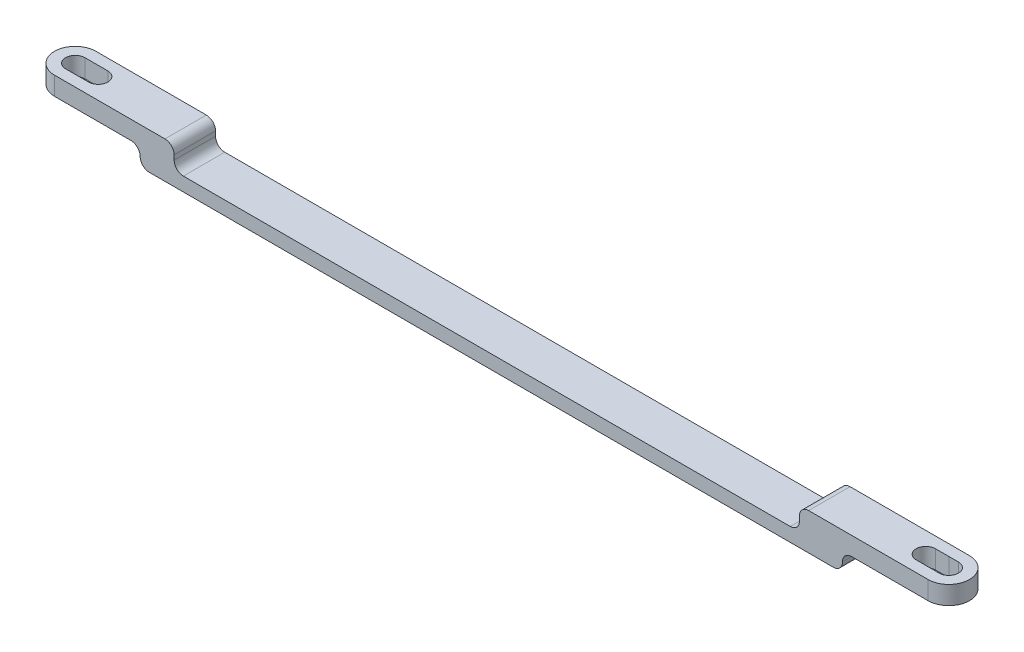
ISO-10303-21;
HEADER;
FILE_DESCRIPTION(('STEP AP214'),'2;1');
FILE_NAME('part.step','',(''),(''),'','','');
FILE_SCHEMA(('AUTOMOTIVE_DESIGN { 1 0 10303 214 1 1 1 1 }'));
ENDSEC;
DATA;
#1=APPLICATION_CONTEXT('core data for automotive mechanical design processes');
#2=APPLICATION_PROTOCOL_DEFINITION('international standard','automotive_design',2000,#1);
#3=PRODUCT_CONTEXT('',#1,'mechanical');
#4=PRODUCT('Part','Part','',(#3));
#5=PRODUCT_RELATED_PRODUCT_CATEGORY('part','',(#4));
#6=PRODUCT_DEFINITION_FORMATION('','',#4);
#7=PRODUCT_DEFINITION_CONTEXT('part definition',#1,'design');
#8=PRODUCT_DEFINITION('design','',#6,#7);
#9=PRODUCT_DEFINITION_SHAPE('','',#8);
#10=(LENGTH_UNIT() NAMED_UNIT(*) SI_UNIT(.MILLI.,.METRE.));
#11=(NAMED_UNIT(*) PLANE_ANGLE_UNIT() SI_UNIT($,.RADIAN.));
#12=(NAMED_UNIT(*) SI_UNIT($,.STERADIAN.) SOLID_ANGLE_UNIT());
#13=UNCERTAINTY_MEASURE_WITH_UNIT(LENGTH_MEASURE(1.E-05),#10,'distance_accuracy_value','');
#14=(GEOMETRIC_REPRESENTATION_CONTEXT(3) GLOBAL_UNCERTAINTY_ASSIGNED_CONTEXT((#13)) GLOBAL_UNIT_ASSIGNED_CONTEXT((#10,
#11,#12)) REPRESENTATION_CONTEXT('',''));
#15=CARTESIAN_POINT('',(0.,0.,0.));
#16=DIRECTION('',(0.,0.,1.));
#17=DIRECTION('',(1.,0.,0.));
#18=AXIS2_PLACEMENT_3D('',#15,#16,#17);
#19=CARTESIAN_POINT('',(0.,4.,0.));
#20=DIRECTION('',(0.,1.,0.));
#21=DIRECTION('',(0.,0.,1.));
#22=AXIS2_PLACEMENT_3D('',#19,#20,#21);
#23=PLANE('',#22);
#24=DIRECTION('',(-1.,0.,0.));
#25=VECTOR('',#24,1.);
#26=CARTESIAN_POINT('',(0.,4.,-4.49999946573208));
#27=LINE('',#26,#25);
#28=CARTESIAN_POINT('',(184.999999457065,4.,-4.49999946573208));
#29=VERTEX_POINT('',#28);
#30=CARTESIAN_POINT('',(159.020897583526,4.,-4.49999946573206));
#31=VERTEX_POINT('',#30);
#32=EDGE_CURVE('E276',#29,#31,#27,.T.);
#33=ORIENTED_EDGE('',*,*,#32,.T.);
#34=DIRECTION('',(0.,0.,-1.));
#35=VECTOR('',#34,1.);
#36=CARTESIAN_POINT('',(159.020897583526,4.,4.50000000000002));
#37=LINE('',#36,#35);
#38=CARTESIAN_POINT('',(159.020897583526,4.,4.49999946573208));
#39=VERTEX_POINT('',#38);
#40=EDGE_CURVE('E49',#31,#39,#37,.F.);
#41=ORIENTED_EDGE('',*,*,#40,.T.);
#42=DIRECTION('',(-1.,0.,0.));
#43=VECTOR('',#42,1.);
#44=CARTESIAN_POINT('',(0.,4.,4.49999946573208));
#45=LINE('',#44,#43);
#46=CARTESIAN_POINT('',(184.999999457065,4.,4.49999946573205));
#47=VERTEX_POINT('',#46);
#48=EDGE_CURVE('E282',#47,#39,#45,.T.);
#49=ORIENTED_EDGE('',*,*,#48,.F.);
#50=CARTESIAN_POINT('',(184.999999457065,4.,0.));
#51=DIRECTION('',(0.,1.,0.));
#52=DIRECTION('',(0.,0.,1.));
#53=AXIS2_PLACEMENT_3D('',#50,#51,#52);
#54=CIRCLE('',#53,4.49999946573207);
#55=EDGE_CURVE('E284',#47,#29,#54,.T.);
#56=ORIENTED_EDGE('',*,*,#55,.T.);
#57=EDGE_LOOP('',(#33,#41,#49,#56));
#58=FACE_BOUND('',#57,.T.);
#59=CARTESIAN_POINT('',(178.950000000015,4.,2.77148096139435E-11));
#60=DIRECTION('',(0.,1.,0.));
#61=DIRECTION('',(0.,0.,1.));
#62=AXIS2_PLACEMENT_3D('',#59,#60,#61);
#63=CIRCLE('',#62,4.49999946573207);
#64=CARTESIAN_POINT('',(182.930860124195,4.,-2.0982725902941));
#65=VERTEX_POINT('',#64);
#66=CARTESIAN_POINT('',(182.925849231003,4.,-2.1077519028382));
#67=VERTEX_POINT('',#66);
#68=EDGE_CURVE('E257',#65,#67,#63,.T.);
#69=ORIENTED_EDGE('',*,*,#68,.F.);
#70=DIRECTION('',(1.,0.,0.));
#71=VECTOR('',#70,1.);
#72=CARTESIAN_POINT('',(0.,4.,-2.09827259029412));
#73=LINE('',#72,#71);
#74=CARTESIAN_POINT('',(184.999999457065,4.,-2.0982725902941));
#75=VERTEX_POINT('',#74);
#76=EDGE_CURVE('E260',#65,#75,#73,.T.);
#77=ORIENTED_EDGE('',*,*,#76,.T.);
#78=CARTESIAN_POINT('',(184.999999457065,4.,0.));
#79=DIRECTION('',(0.,1.,0.));
#80=DIRECTION('',(0.,0.,1.));
#81=AXIS2_PLACEMENT_3D('',#78,#79,#80);
#82=CIRCLE('',#81,2.0982725902941);
#83=CARTESIAN_POINT('',(184.999999457065,4.,2.0982725902941));
#84=VERTEX_POINT('',#83);
#85=EDGE_CURVE('E262',#84,#75,#82,.T.);
#86=ORIENTED_EDGE('',*,*,#85,.F.);
#87=DIRECTION('',(1.,0.,0.));
#88=VECTOR('',#87,1.);
#89=CARTESIAN_POINT('',(0.,4.,2.0982725902941));
#90=LINE('',#89,#88);
#91=CARTESIAN_POINT('',(179.999998560699,4.,2.0982725902941));
#92=VERTEX_POINT('',#91);
#93=EDGE_CURVE('E266',#92,#84,#90,.T.);
#94=ORIENTED_EDGE('',*,*,#93,.F.);
#95=CARTESIAN_POINT('',(179.999998560699,4.,0.));
#96=DIRECTION('',(0.,1.,0.));
#97=DIRECTION('',(0.,0.,1.));
#98=AXIS2_PLACEMENT_3D('',#95,#96,#97);
#99=CIRCLE('',#98,2.0982725902941);
#100=CARTESIAN_POINT('',(179.999998560699,4.,-2.0982725902941));
#101=VERTEX_POINT('',#100);
#102=EDGE_CURVE('E269',#101,#92,#99,.T.);
#103=ORIENTED_EDGE('',*,*,#102,.F.);
#104=CARTESIAN_POINT('',(182.917630381031,4.,-2.09827259029409));
#105=VERTEX_POINT('',#104);
#106=EDGE_CURVE('E263',#101,#105,#73,.T.);
#107=ORIENTED_EDGE('',*,*,#106,.T.);
#108=DIRECTION('',(-0.655087365602055,0.,0.755553137395749));
#109=VECTOR('',#108,1.);
#110=CARTESIAN_POINT('',(103.381910909006,4.,89.6352358508098));
#111=LINE('',#110,#109);
#112=EDGE_CURVE('E272',#67,#105,#111,.T.);
#113=ORIENTED_EDGE('',*,*,#112,.F.);
#114=EDGE_LOOP('',(#69,#77,#86,#94,#103,#107,#113));
#115=FACE_BOUND('',#114,.T.);
#116=ADVANCED_FACE('F32',(#58,#115),#23,.T.);
#117=CARTESIAN_POINT('',(0.,0.,0.));
#118=DIRECTION('',(0.,1.,0.));
#119=DIRECTION('',(0.,0.,1.));
#120=AXIS2_PLACEMENT_3D('',#117,#118,#119);
#121=PLANE('',#120);
#122=CARTESIAN_POINT('',(178.950000000015,0.,2.77148096139435E-11));
#123=DIRECTION('',(0.,1.,0.));
#124=DIRECTION('',(0.,0.,1.));
#125=AXIS2_PLACEMENT_3D('',#122,#123,#124);
#126=CIRCLE('',#125,4.49999946573207);
#127=CARTESIAN_POINT('',(182.930860124195,0.,-2.0982725902941));
#128=VERTEX_POINT('',#127);
#129=CARTESIAN_POINT('',(182.925849231003,0.,-2.1077519028382));
#130=VERTEX_POINT('',#129);
#131=EDGE_CURVE('E297',#128,#130,#126,.T.);
#132=ORIENTED_EDGE('',*,*,#131,.T.);
#133=DIRECTION('',(-0.655087365602055,0.,0.755553137395749));
#134=VECTOR('',#133,1.);
#135=CARTESIAN_POINT('',(103.381910909006,0.,89.6352358508098));
#136=LINE('',#135,#134);
#137=CARTESIAN_POINT('',(182.917630381031,0.,-2.09827259029409));
#138=VERTEX_POINT('',#137);
#139=EDGE_CURVE('E313',#130,#138,#136,.T.);
#140=ORIENTED_EDGE('',*,*,#139,.T.);
#141=DIRECTION('',(1.,0.,0.));
#142=VECTOR('',#141,1.);
#143=CARTESIAN_POINT('',(0.,0.,-2.09827259029412));
#144=LINE('',#143,#142);
#145=CARTESIAN_POINT('',(179.999998560699,0.,-2.0982725902941));
#146=VERTEX_POINT('',#145);
#147=EDGE_CURVE('E304',#146,#138,#144,.T.);
#148=ORIENTED_EDGE('',*,*,#147,.F.);
#149=CARTESIAN_POINT('',(179.999998560699,0.,0.));
#150=DIRECTION('',(0.,1.,0.));
#151=DIRECTION('',(0.,0.,1.));
#152=AXIS2_PLACEMENT_3D('',#149,#150,#151);
#153=CIRCLE('',#152,2.0982725902941);
#154=CARTESIAN_POINT('',(179.999998560699,0.,2.0982725902941));
#155=VERTEX_POINT('',#154);
#156=EDGE_CURVE('E310',#146,#155,#153,.T.);
#157=ORIENTED_EDGE('',*,*,#156,.T.);
#158=DIRECTION('',(1.,0.,0.));
#159=VECTOR('',#158,1.);
#160=CARTESIAN_POINT('',(0.,0.,2.0982725902941));
#161=LINE('',#160,#159);
#162=CARTESIAN_POINT('',(184.999999457065,0.,2.0982725902941));
#163=VERTEX_POINT('',#162);
#164=EDGE_CURVE('E307',#155,#163,#161,.T.);
#165=ORIENTED_EDGE('',*,*,#164,.T.);
#166=CARTESIAN_POINT('',(184.999999457065,0.,0.));
#167=DIRECTION('',(0.,1.,0.));
#168=DIRECTION('',(0.,0.,1.));
#169=AXIS2_PLACEMENT_3D('',#166,#167,#168);
#170=CIRCLE('',#169,2.0982725902941);
#171=CARTESIAN_POINT('',(184.999999457065,0.,-2.0982725902941));
#172=VERTEX_POINT('',#171);
#173=EDGE_CURVE('E303',#163,#172,#170,.T.);
#174=ORIENTED_EDGE('',*,*,#173,.T.);
#175=EDGE_CURVE('E300',#128,#172,#144,.T.);
#176=ORIENTED_EDGE('',*,*,#175,.F.);
#177=EDGE_LOOP('',(#132,#140,#148,#157,#165,#174,#176));
#178=FACE_BOUND('',#177,.T.);
#179=DIRECTION('',(-1.,0.,0.));
#180=VECTOR('',#179,1.);
#181=CARTESIAN_POINT('',(0.,0.,4.49999946573208));
#182=LINE('',#181,#180);
#183=CARTESIAN_POINT('',(184.999999457065,0.,4.49999946573205));
#184=VERTEX_POINT('',#183);
#185=CARTESIAN_POINT('',(168.374342947361,0.,4.49999946573208));
#186=VERTEX_POINT('',#185);
#187=EDGE_CURVE('E324',#184,#186,#182,.T.);
#188=ORIENTED_EDGE('',*,*,#187,.T.);
#189=DIRECTION('',(0.,0.,1.));
#190=VECTOR('',#189,1.);
#191=CARTESIAN_POINT('',(168.374342947361,0.,-4.49999946573206));
#192=LINE('',#191,#190);
#193=CARTESIAN_POINT('',(168.374342947361,0.,-4.49999946573206));
#194=VERTEX_POINT('',#193);
#195=EDGE_CURVE('E397',#186,#194,#192,.F.);
#196=ORIENTED_EDGE('',*,*,#195,.T.);
#197=DIRECTION('',(-1.,0.,0.));
#198=VECTOR('',#197,1.);
#199=CARTESIAN_POINT('',(0.,0.,-4.49999946573208));
#200=LINE('',#199,#198);
#201=CARTESIAN_POINT('',(184.999999457065,0.,-4.49999946573208));
#202=VERTEX_POINT('',#201);
#203=EDGE_CURVE('E317',#202,#194,#200,.T.);
#204=ORIENTED_EDGE('',*,*,#203,.F.);
#205=CARTESIAN_POINT('',(184.999999457065,0.,0.));
#206=DIRECTION('',(0.,1.,0.));
#207=DIRECTION('',(0.,0.,1.));
#208=AXIS2_PLACEMENT_3D('',#205,#206,#207);
#209=CIRCLE('',#208,4.49999946573207);
#210=EDGE_CURVE('E248',#184,#202,#209,.T.);
#211=ORIENTED_EDGE('',*,*,#210,.F.);
#212=EDGE_LOOP('',(#188,#196,#204,#211));
#213=FACE_BOUND('',#212,.T.);
#214=ADVANCED_FACE('F433',(#178,#213),#121,.F.);
#215=CARTESIAN_POINT('',(0.,0.,0.));
#216=DIRECTION('',(0.,1.,0.));
#217=DIRECTION('',(0.,0.,1.));
#218=AXIS2_PLACEMENT_3D('',#215,#216,#217);
#219=CIRCLE('',#218,2.09999937075112);
#220=CARTESIAN_POINT('',(0.,0.,2.09999937075112));
#221=VERTEX_POINT('',#220);
#222=CARTESIAN_POINT('',(0.,0.,-2.09999937075112));
#223=VERTEX_POINT('',#222);
#224=EDGE_CURVE('E231',#221,#223,#219,.T.);
#225=ORIENTED_EDGE('',*,*,#224,.T.);
#226=DIRECTION('',(1.,0.,0.));
#227=VECTOR('',#226,1.);
#228=CARTESIAN_POINT('',(0.,0.,-2.09999937075112));
#229=LINE('',#228,#227);
#230=CARTESIAN_POINT('',(-5.,0.,-2.09999937075112));
#231=VERTEX_POINT('',#230);
#232=EDGE_CURVE('E294',#231,#223,#229,.T.);
#233=ORIENTED_EDGE('',*,*,#232,.F.);
#234=CARTESIAN_POINT('',(-5.,0.,0.));
#235=DIRECTION('',(0.,1.,0.));
#236=DIRECTION('',(0.,0.,1.));
#237=AXIS2_PLACEMENT_3D('',#234,#235,#236);
#238=CIRCLE('',#237,2.09999937075112);
#239=CARTESIAN_POINT('',(-5.,0.,2.09999937075112));
#240=VERTEX_POINT('',#239);
#241=EDGE_CURVE('E291',#231,#240,#238,.T.);
#242=ORIENTED_EDGE('',*,*,#241,.T.);
#243=DIRECTION('',(1.,0.,0.));
#244=VECTOR('',#243,1.);
#245=CARTESIAN_POINT('',(0.,0.,2.09999937075112));
#246=LINE('',#245,#244);
#247=EDGE_CURVE('E288',#240,#221,#246,.T.);
#248=ORIENTED_EDGE('',*,*,#247,.T.);
#249=EDGE_LOOP('',(#225,#233,#242,#248));
#250=FACE_BOUND('',#249,.T.);
#251=CARTESIAN_POINT('',(11.6256570526385,0.,-4.49999946573208));
#252=VERTEX_POINT('',#251);
#253=CARTESIAN_POINT('',(-5.,0.,-4.49999946573208));
#254=VERTEX_POINT('',#253);
#255=EDGE_CURVE('E316',#252,#254,#200,.T.);
#256=ORIENTED_EDGE('',*,*,#255,.F.);
#257=DIRECTION('',(0.,0.,-1.));
#258=VECTOR('',#257,1.);
#259=CARTESIAN_POINT('',(11.6256570526385,0.,4.49999946573208));
#260=LINE('',#259,#258);
#261=CARTESIAN_POINT('',(11.6256570526385,0.,4.49999946573208));
#262=VERTEX_POINT('',#261);
#263=EDGE_CURVE('E395',#252,#262,#260,.F.);
#264=ORIENTED_EDGE('',*,*,#263,.T.);
#265=CARTESIAN_POINT('',(-5.,0.,4.49999946573208));
#266=VERTEX_POINT('',#265);
#267=EDGE_CURVE('E323',#262,#266,#182,.T.);
#268=ORIENTED_EDGE('',*,*,#267,.T.);
#269=CARTESIAN_POINT('',(-5.,0.,0.));
#270=DIRECTION('',(0.,1.,0.));
#271=DIRECTION('',(0.,0.,1.));
#272=AXIS2_PLACEMENT_3D('',#269,#270,#271);
#273=CIRCLE('',#272,4.49999946573208);
#274=EDGE_CURVE('E320',#254,#266,#273,.T.);
#275=ORIENTED_EDGE('',*,*,#274,.F.);
#276=EDGE_LOOP('',(#256,#264,#268,#275));
#277=FACE_BOUND('',#276,.T.);
#278=ADVANCED_FACE('F481',(#250,#277),#121,.F.);
#279=CARTESIAN_POINT('',(0.,4.,-4.49999946573208));
#280=DIRECTION('',(0.,0.,1.));
#281=DIRECTION('',(1.,0.,0.));
#282=AXIS2_PLACEMENT_3D('',#279,#280,#281);
#283=PLANE('',#282);
#284=DIRECTION('',(1.,0.,0.));
#285=VECTOR('',#284,1.);
#286=CARTESIAN_POINT('',(13.6256570526385,-4.,-4.50000053426794));
#287=LINE('',#286,#285);
#288=CARTESIAN_POINT('',(15.6256570526385,-4.,-4.50000053426794));
#289=VERTEX_POINT('',#288);
#290=CARTESIAN_POINT('',(164.374342947361,-4.,-4.50000053426794));
#291=VERTEX_POINT('',#290);
#292=EDGE_CURVE('E289',#289,#291,#287,.T.);
#293=ORIENTED_EDGE('',*,*,#292,.F.);
#294=CARTESIAN_POINT('',(15.6256570526385,-2.,-4.49999946573208));
#295=DIRECTION('',(0.,0.,1.));
#296=DIRECTION('',(1.,0.,0.));
#297=AXIS2_PLACEMENT_3D('',#294,#295,#296);
#298=CIRCLE('',#297,2.);
#299=CARTESIAN_POINT('',(13.6256570526385,-2.,-4.50000053426794));
#300=VERTEX_POINT('',#299);
#301=EDGE_CURVE('E378',#289,#300,#298,.F.);
#302=ORIENTED_EDGE('',*,*,#301,.T.);
#303=CARTESIAN_POINT('',(11.6256570526385,-2.,-4.49999946573208));
#304=DIRECTION('',(0.,0.,1.));
#305=DIRECTION('',(1.,0.,0.));
#306=AXIS2_PLACEMENT_3D('',#303,#304,#305);
#307=CIRCLE('',#306,2.);
#308=EDGE_CURVE('E408',#300,#252,#307,.T.);
#309=ORIENTED_EDGE('',*,*,#308,.T.);
#310=ORIENTED_EDGE('',*,*,#255,.T.);
#311=DIRECTION('',(0.,-1.,0.));
#312=VECTOR('',#311,1.);
#313=CARTESIAN_POINT('',(-5.,4.,-4.49999946573208));
#314=LINE('',#313,#312);
#315=CARTESIAN_POINT('',(-5.,4.,-4.49999946573208));
#316=VERTEX_POINT('',#315);
#317=EDGE_CURVE('E336',#316,#254,#314,.T.);
#318=ORIENTED_EDGE('',*,*,#317,.F.);
#319=CARTESIAN_POINT('',(19.0208975835264,4.,-4.49999946573208));
#320=VERTEX_POINT('',#319);
#321=EDGE_CURVE('E275',#320,#316,#27,.T.);
#322=ORIENTED_EDGE('',*,*,#321,.F.);
#323=CARTESIAN_POINT('',(19.0208975835264,2.,-4.49999946573208));
#324=DIRECTION('',(0.,0.,1.));
#325=DIRECTION('',(1.,0.,0.));
#326=AXIS2_PLACEMENT_3D('',#323,#324,#325);
#327=CIRCLE('',#326,2.);
#328=CARTESIAN_POINT('',(21.0208975835264,2.,-4.49999878929106));
#329=VERTEX_POINT('',#328);
#330=EDGE_CURVE('E374',#320,#329,#327,.F.);
#331=ORIENTED_EDGE('',*,*,#330,.T.);
#332=DIRECTION('',(0.,1.,0.));
#333=VECTOR('',#332,1.);
#334=CARTESIAN_POINT('',(21.0208975835264,-1.,-4.49999878929106));
#335=LINE('',#334,#333);
#336=CARTESIAN_POINT('',(21.0208975835264,1.,-4.49999878929106));
#337=VERTEX_POINT('',#336);
#338=EDGE_CURVE('E458',#337,#329,#335,.T.);
#339=ORIENTED_EDGE('',*,*,#338,.F.);
#340=CARTESIAN_POINT('',(23.0208975835264,1.,-4.49999946573208));
#341=DIRECTION('',(0.,0.,1.));
#342=DIRECTION('',(1.,0.,0.));
#343=AXIS2_PLACEMENT_3D('',#340,#341,#342);
#344=CIRCLE('',#343,2.);
#345=CARTESIAN_POINT('',(23.0208975835264,-1.,-4.49999878929106));
#346=VERTEX_POINT('',#345);
#347=EDGE_CURVE('E406',#337,#346,#344,.T.);
#348=ORIENTED_EDGE('',*,*,#347,.T.);
#349=DIRECTION('',(-1.,0.,0.));
#350=VECTOR('',#349,1.);
#351=CARTESIAN_POINT('',(21.0208975835264,-1.,-4.49999878929106));
#352=LINE('',#351,#350);
#353=CARTESIAN_POINT('',(155.020897583526,-1.,-4.49999878929106));
#354=VERTEX_POINT('',#353);
#355=EDGE_CURVE('E414',#354,#346,#352,.T.);
#356=ORIENTED_EDGE('',*,*,#355,.F.);
#357=CARTESIAN_POINT('',(155.020897583526,1.,-4.49999946573206));
#358=DIRECTION('',(0.,0.,1.));
#359=DIRECTION('',(1.,0.,0.));
#360=AXIS2_PLACEMENT_3D('',#357,#358,#359);
#361=CIRCLE('',#360,2.);
#362=CARTESIAN_POINT('',(157.020897583526,1.,-4.49999878929106));
#363=VERTEX_POINT('',#362);
#364=EDGE_CURVE('E400',#354,#363,#361,.T.);
#365=ORIENTED_EDGE('',*,*,#364,.T.);
#366=DIRECTION('',(0.,1.,0.));
#367=VECTOR('',#366,1.);
#368=CARTESIAN_POINT('',(157.020897583526,-1.,-4.49999878929106));
#369=LINE('',#368,#367);
#370=CARTESIAN_POINT('',(157.020897583526,2.,-4.49999878929106));
#371=VERTEX_POINT('',#370);
#372=EDGE_CURVE('E454',#363,#371,#369,.T.);
#373=ORIENTED_EDGE('',*,*,#372,.T.);
#374=CARTESIAN_POINT('',(159.020897583526,2.,-4.49999946573206));
#375=DIRECTION('',(0.,0.,1.));
#376=DIRECTION('',(1.,0.,0.));
#377=AXIS2_PLACEMENT_3D('',#374,#375,#376);
#378=CIRCLE('',#377,2.);
#379=EDGE_CURVE('E372',#371,#31,#378,.F.);
#380=ORIENTED_EDGE('',*,*,#379,.T.);
#381=ORIENTED_EDGE('',*,*,#32,.F.);
#382=DIRECTION('',(0.,-1.,0.));
#383=VECTOR('',#382,1.);
#384=CARTESIAN_POINT('',(184.999999457065,4.,-4.49999946573208));
#385=LINE('',#384,#383);
#386=EDGE_CURVE('E327',#29,#202,#385,.T.);
#387=ORIENTED_EDGE('',*,*,#386,.T.);
#388=ORIENTED_EDGE('',*,*,#203,.T.);
#389=CARTESIAN_POINT('',(168.374342947361,-2.,-4.49999946573206));
#390=DIRECTION('',(0.,0.,1.));
#391=DIRECTION('',(1.,0.,0.));
#392=AXIS2_PLACEMENT_3D('',#389,#390,#391);
#393=CIRCLE('',#392,2.);
#394=CARTESIAN_POINT('',(166.374342947361,-2.,-4.50000053426794));
#395=VERTEX_POINT('',#394);
#396=EDGE_CURVE('E11',#194,#395,#393,.T.);
#397=ORIENTED_EDGE('',*,*,#396,.T.);
#398=CARTESIAN_POINT('',(164.374342947361,-2.,-4.49999946573206));
#399=DIRECTION('',(0.,0.,1.));
#400=DIRECTION('',(1.,0.,0.));
#401=AXIS2_PLACEMENT_3D('',#398,#399,#400);
#402=CIRCLE('',#401,2.);
#403=EDGE_CURVE('E376',#395,#291,#402,.F.);
#404=ORIENTED_EDGE('',*,*,#403,.T.);
#405=EDGE_LOOP('',(#293,#302,#309,#310,#318,#322,#331,#339,#348,#356,#365,#373,#380,#381,#387,
#388,#397,#404));
#406=FACE_BOUND('',#405,.T.);
#407=ADVANCED_FACE('F437',(#406),#283,.F.);
#408=CARTESIAN_POINT('',(-5.,4.,0.));
#409=DIRECTION('',(0.,-1.,0.));
#410=DIRECTION('',(0.,0.,-1.));
#411=AXIS2_PLACEMENT_3D('',#408,#409,#410);
#412=CYLINDRICAL_SURFACE('',#411,4.49999946573208);
#413=ORIENTED_EDGE('',*,*,#274,.T.);
#414=DIRECTION('',(0.,-1.,0.));
#415=VECTOR('',#414,1.);
#416=CARTESIAN_POINT('',(-5.,4.,4.49999946573208));
#417=LINE('',#416,#415);
#418=CARTESIAN_POINT('',(-5.,4.,4.49999946573208));
#419=VERTEX_POINT('',#418);
#420=EDGE_CURVE('E333',#419,#266,#417,.T.);
#421=ORIENTED_EDGE('',*,*,#420,.F.);
#422=CARTESIAN_POINT('',(-5.,4.,0.));
#423=DIRECTION('',(0.,1.,0.));
#424=DIRECTION('',(0.,0.,1.));
#425=AXIS2_PLACEMENT_3D('',#422,#423,#424);
#426=CIRCLE('',#425,4.49999946573208);
#427=EDGE_CURVE('E278',#316,#419,#426,.T.);
#428=ORIENTED_EDGE('',*,*,#427,.F.);
#429=ORIENTED_EDGE('',*,*,#317,.T.);
#430=EDGE_LOOP('',(#413,#421,#428,#429));
#431=FACE_BOUND('',#430,.T.);
#432=ADVANCED_FACE('F487',(#431),#412,.T.);
#433=CARTESIAN_POINT('',(0.,4.,4.49999946573208));
#434=DIRECTION('',(0.,0.,1.));
#435=DIRECTION('',(1.,0.,0.));
#436=AXIS2_PLACEMENT_3D('',#433,#434,#435);
#437=PLANE('',#436);
#438=ORIENTED_EDGE('',*,*,#267,.F.);
#439=CARTESIAN_POINT('',(11.6256570526385,-2.,4.49999946573208));
#440=DIRECTION('',(0.,0.,1.));
#441=DIRECTION('',(1.,0.,0.));
#442=AXIS2_PLACEMENT_3D('',#439,#440,#441);
#443=CIRCLE('',#442,2.);
#444=CARTESIAN_POINT('',(13.6256570526385,-2.,4.49999946573206));
#445=VERTEX_POINT('',#444);
#446=EDGE_CURVE('E410',#262,#445,#443,.F.);
#447=ORIENTED_EDGE('',*,*,#446,.T.);
#448=CARTESIAN_POINT('',(15.6256570526385,-2.,4.49999946573208));
#449=DIRECTION('',(0.,0.,1.));
#450=DIRECTION('',(1.,0.,0.));
#451=AXIS2_PLACEMENT_3D('',#448,#449,#450);
#452=CIRCLE('',#451,2.);
#453=CARTESIAN_POINT('',(15.6256570526386,-4.,4.49999946573206));
#454=VERTEX_POINT('',#453);
#455=EDGE_CURVE('E386',#445,#454,#452,.T.);
#456=ORIENTED_EDGE('',*,*,#455,.T.);
#457=DIRECTION('',(-1.,0.,0.));
#458=VECTOR('',#457,1.);
#459=CARTESIAN_POINT('',(166.374342947361,-4.,4.49999946573208));
#460=LINE('',#459,#458);
#461=CARTESIAN_POINT('',(164.374342947361,-4.,4.49999946573208));
#462=VERTEX_POINT('',#461);
#463=EDGE_CURVE('E467',#462,#454,#460,.T.);
#464=ORIENTED_EDGE('',*,*,#463,.F.);
#465=CARTESIAN_POINT('',(164.374342947361,-2.,4.49999946573208));
#466=DIRECTION('',(0.,0.,1.));
#467=DIRECTION('',(1.,0.,0.));
#468=AXIS2_PLACEMENT_3D('',#465,#466,#467);
#469=CIRCLE('',#468,2.);
#470=CARTESIAN_POINT('',(166.374342947361,-2.,4.49999946573208));
#471=VERTEX_POINT('',#470);
#472=EDGE_CURVE('E384',#462,#471,#469,.T.);
#473=ORIENTED_EDGE('',*,*,#472,.T.);
#474=CARTESIAN_POINT('',(168.374342947361,-2.,4.49999946573208));
#475=DIRECTION('',(0.,0.,1.));
#476=DIRECTION('',(1.,0.,0.));
#477=AXIS2_PLACEMENT_3D('',#474,#475,#476);
#478=CIRCLE('',#477,2.);
#479=EDGE_CURVE('E41',#471,#186,#478,.F.);
#480=ORIENTED_EDGE('',*,*,#479,.T.);
#481=ORIENTED_EDGE('',*,*,#187,.F.);
#482=DIRECTION('',(0.,-1.,0.));
#483=VECTOR('',#482,1.);
#484=CARTESIAN_POINT('',(184.999999457065,4.,4.49999946573205));
#485=LINE('',#484,#483);
#486=EDGE_CURVE('E330',#47,#184,#485,.T.);
#487=ORIENTED_EDGE('',*,*,#486,.F.);
#488=ORIENTED_EDGE('',*,*,#48,.T.);
#489=CARTESIAN_POINT('',(159.020897583526,2.,4.49999946573208));
#490=DIRECTION('',(0.,0.,1.));
#491=DIRECTION('',(1.,0.,0.));
#492=AXIS2_PLACEMENT_3D('',#489,#490,#491);
#493=CIRCLE('',#492,2.);
#494=CARTESIAN_POINT('',(157.020897583526,2.,4.50000000000002));
#495=VERTEX_POINT('',#494);
#496=EDGE_CURVE('E380',#39,#495,#493,.T.);
#497=ORIENTED_EDGE('',*,*,#496,.T.);
#498=DIRECTION('',(0.,1.,0.));
#499=VECTOR('',#498,1.);
#500=CARTESIAN_POINT('',(157.020897583526,-1.,4.50000000000002));
#501=LINE('',#500,#499);
#502=CARTESIAN_POINT('',(157.020897583526,1.,4.50000000000002));
#503=VERTEX_POINT('',#502);
#504=EDGE_CURVE('E456',#503,#495,#501,.T.);
#505=ORIENTED_EDGE('',*,*,#504,.F.);
#506=CARTESIAN_POINT('',(155.020897583526,1.,4.49999946573208));
#507=DIRECTION('',(0.,0.,1.));
#508=DIRECTION('',(1.,0.,0.));
#509=AXIS2_PLACEMENT_3D('',#506,#507,#508);
#510=CIRCLE('',#509,2.);
#511=CARTESIAN_POINT('',(155.020897583526,-1.,4.50000000000002));
#512=VERTEX_POINT('',#511);
#513=EDGE_CURVE('E402',#503,#512,#510,.F.);
#514=ORIENTED_EDGE('',*,*,#513,.T.);
#515=DIRECTION('',(1.,0.,0.));
#516=VECTOR('',#515,1.);
#517=CARTESIAN_POINT('',(21.0208975835264,-1.,4.50000000000002));
#518=LINE('',#517,#516);
#519=CARTESIAN_POINT('',(23.0208975835264,-1.,4.50000000000002));
#520=VERTEX_POINT('',#519);
#521=EDGE_CURVE('E419',#520,#512,#518,.T.);
#522=ORIENTED_EDGE('',*,*,#521,.F.);
#523=CARTESIAN_POINT('',(23.0208975835264,1.,4.49999946573208));
#524=DIRECTION('',(0.,0.,1.));
#525=DIRECTION('',(1.,0.,0.));
#526=AXIS2_PLACEMENT_3D('',#523,#524,#525);
#527=CIRCLE('',#526,2.);
#528=CARTESIAN_POINT('',(21.0208975835264,1.,4.50000000000002));
#529=VERTEX_POINT('',#528);
#530=EDGE_CURVE('E404',#520,#529,#527,.F.);
#531=ORIENTED_EDGE('',*,*,#530,.T.);
#532=DIRECTION('',(0.,1.,0.));
#533=VECTOR('',#532,1.);
#534=CARTESIAN_POINT('',(21.0208975835264,-1.,4.50000000000002));
#535=LINE('',#534,#533);
#536=CARTESIAN_POINT('',(21.0208975835264,2.,4.50000000000002));
#537=VERTEX_POINT('',#536);
#538=EDGE_CURVE('E461',#529,#537,#535,.T.);
#539=ORIENTED_EDGE('',*,*,#538,.T.);
#540=CARTESIAN_POINT('',(19.0208975835264,2.,4.49999946573208));
#541=DIRECTION('',(0.,0.,1.));
#542=DIRECTION('',(1.,0.,0.));
#543=AXIS2_PLACEMENT_3D('',#540,#541,#542);
#544=CIRCLE('',#543,2.);
#545=CARTESIAN_POINT('',(19.0208975835264,4.,4.49999946573208));
#546=VERTEX_POINT('',#545);
#547=EDGE_CURVE('E382',#537,#546,#544,.T.);
#548=ORIENTED_EDGE('',*,*,#547,.T.);
#549=EDGE_CURVE('E281',#546,#419,#45,.T.);
#550=ORIENTED_EDGE('',*,*,#549,.T.);
#551=ORIENTED_EDGE('',*,*,#420,.T.);
#552=EDGE_LOOP('',(#438,#447,#456,#464,#473,#480,#481,#487,#488,#497,#505,#514,#522,#531,#539,
#548,#550,#551));
#553=FACE_BOUND('',#552,.T.);
#554=ADVANCED_FACE('F444',(#553),#437,.T.);
#555=CARTESIAN_POINT('',(178.950000000015,4.,2.77148096139435E-11));
#556=DIRECTION('',(0.,-1.,0.));
#557=DIRECTION('',(0.,0.,-1.));
#558=AXIS2_PLACEMENT_3D('',#555,#556,#557);
#559=CYLINDRICAL_SURFACE('',#558,4.49999946573207);
#560=ORIENTED_EDGE('',*,*,#131,.F.);
#561=DIRECTION('',(0.,-1.,0.));
#562=VECTOR('',#561,1.);
#563=CARTESIAN_POINT('',(182.930860124195,4.,-2.0982725902941));
#564=LINE('',#563,#562);
#565=EDGE_CURVE('E331',#65,#128,#564,.T.);
#566=ORIENTED_EDGE('',*,*,#565,.F.);
#567=ORIENTED_EDGE('',*,*,#68,.T.);
#568=DIRECTION('',(0.,-1.,0.));
#569=VECTOR('',#568,1.);
#570=CARTESIAN_POINT('',(182.925849231003,4.,-2.1077519028382));
#571=LINE('',#570,#569);
#572=EDGE_CURVE('E236',#67,#130,#571,.T.);
#573=ORIENTED_EDGE('',*,*,#572,.T.);
#574=EDGE_LOOP('',(#560,#566,#567,#573));
#575=FACE_BOUND('',#574,.T.);
#576=ADVANCED_FACE('F550',(#575),#559,.F.);
#577=CARTESIAN_POINT('',(0.,4.,-2.09827259029412));
#578=DIRECTION('',(0.,0.,-1.));
#579=DIRECTION('',(-1.,0.,0.));
#580=AXIS2_PLACEMENT_3D('',#577,#578,#579);
#581=PLANE('',#580);
#582=ORIENTED_EDGE('',*,*,#175,.T.);
#583=DIRECTION('',(0.,-1.,0.));
#584=VECTOR('',#583,1.);
#585=CARTESIAN_POINT('',(184.999999457065,4.,-2.0982725902941));
#586=LINE('',#585,#584);
#587=EDGE_CURVE('E349',#75,#172,#586,.T.);
#588=ORIENTED_EDGE('',*,*,#587,.F.);
#589=ORIENTED_EDGE('',*,*,#76,.F.);
#590=ORIENTED_EDGE('',*,*,#565,.T.);
#591=EDGE_LOOP('',(#582,#588,#589,#590));
#592=FACE_BOUND('',#591,.T.);
#593=ADVANCED_FACE('F564',(#592),#581,.F.);
#594=CARTESIAN_POINT('',(184.999999457065,4.,0.));
#595=DIRECTION('',(0.,-1.,0.));
#596=DIRECTION('',(0.,0.,-1.));
#597=AXIS2_PLACEMENT_3D('',#594,#595,#596);
#598=CYLINDRICAL_SURFACE('',#597,2.0982725902941);
#599=ORIENTED_EDGE('',*,*,#173,.F.);
#600=DIRECTION('',(0.,-1.,0.));
#601=VECTOR('',#600,1.);
#602=CARTESIAN_POINT('',(184.999999457065,4.,2.0982725902941));
#603=LINE('',#602,#601);
#604=EDGE_CURVE('E347',#84,#163,#603,.T.);
#605=ORIENTED_EDGE('',*,*,#604,.F.);
#606=ORIENTED_EDGE('',*,*,#85,.T.);
#607=ORIENTED_EDGE('',*,*,#587,.T.);
#608=EDGE_LOOP('',(#599,#605,#606,#607));
#609=FACE_BOUND('',#608,.T.);
#610=ADVANCED_FACE('F571',(#609),#598,.F.);
#611=CARTESIAN_POINT('',(0.,4.,2.0982725902941));
#612=DIRECTION('',(0.,0.,-1.));
#613=DIRECTION('',(-1.,0.,0.));
#614=AXIS2_PLACEMENT_3D('',#611,#612,#613);
#615=PLANE('',#614);
#616=ORIENTED_EDGE('',*,*,#164,.F.);
#617=DIRECTION('',(0.,-1.,0.));
#618=VECTOR('',#617,1.);
#619=CARTESIAN_POINT('',(179.999998560699,4.,2.0982725902941));
#620=LINE('',#619,#618);
#621=EDGE_CURVE('E345',#92,#155,#620,.T.);
#622=ORIENTED_EDGE('',*,*,#621,.F.);
#623=ORIENTED_EDGE('',*,*,#93,.T.);
#624=ORIENTED_EDGE('',*,*,#604,.T.);
#625=EDGE_LOOP('',(#616,#622,#623,#624));
#626=FACE_BOUND('',#625,.T.);
#627=ADVANCED_FACE('F567',(#626),#615,.T.);
#628=CARTESIAN_POINT('',(179.999998560699,4.,0.));
#629=DIRECTION('',(0.,-1.,0.));
#630=DIRECTION('',(0.,0.,-1.));
#631=AXIS2_PLACEMENT_3D('',#628,#629,#630);
#632=CYLINDRICAL_SURFACE('',#631,2.0982725902941);
#633=ORIENTED_EDGE('',*,*,#156,.F.);
#634=DIRECTION('',(0.,-1.,0.));
#635=VECTOR('',#634,1.);
#636=CARTESIAN_POINT('',(179.999998560699,4.,-2.0982725902941));
#637=LINE('',#636,#635);
#638=EDGE_CURVE('E343',#101,#146,#637,.T.);
#639=ORIENTED_EDGE('',*,*,#638,.F.);
#640=ORIENTED_EDGE('',*,*,#102,.T.);
#641=ORIENTED_EDGE('',*,*,#621,.T.);
#642=EDGE_LOOP('',(#633,#639,#640,#641));
#643=FACE_BOUND('',#642,.T.);
#644=ADVANCED_FACE('F562',(#643),#632,.F.);
#645=ORIENTED_EDGE('',*,*,#147,.T.);
#646=DIRECTION('',(0.,-1.,0.));
#647=VECTOR('',#646,1.);
#648=CARTESIAN_POINT('',(182.917630381031,4.,-2.09827259029409));
#649=LINE('',#648,#647);
#650=EDGE_CURVE('E341',#105,#138,#649,.T.);
#651=ORIENTED_EDGE('',*,*,#650,.F.);
#652=ORIENTED_EDGE('',*,*,#106,.F.);
#653=ORIENTED_EDGE('',*,*,#638,.T.);
#654=EDGE_LOOP('',(#645,#651,#652,#653));
#655=FACE_BOUND('',#654,.T.);
#656=ADVANCED_FACE('F559',(#655),#581,.F.);
#657=CARTESIAN_POINT('',(0.,4.,0.));
#658=DIRECTION('',(0.,-1.,0.));
#659=DIRECTION('',(0.,0.,-1.));
#660=AXIS2_PLACEMENT_3D('',#657,#658,#659);
#661=CYLINDRICAL_SURFACE('',#660,2.09999937075112);
#662=ORIENTED_EDGE('',*,*,#224,.F.);
#663=DIRECTION('',(0.,-1.,0.));
#664=VECTOR('',#663,1.);
#665=CARTESIAN_POINT('',(0.,4.,2.09999937075112));
#666=LINE('',#665,#664);
#667=CARTESIAN_POINT('',(0.,4.,2.09999937075112));
#668=VERTEX_POINT('',#667);
#669=EDGE_CURVE('E226',#668,#221,#666,.T.);
#670=ORIENTED_EDGE('',*,*,#669,.F.);
#671=CARTESIAN_POINT('',(0.,4.,0.));
#672=DIRECTION('',(0.,1.,0.));
#673=DIRECTION('',(0.,0.,1.));
#674=AXIS2_PLACEMENT_3D('',#671,#672,#673);
#675=CIRCLE('',#674,2.09999937075112);
#676=CARTESIAN_POINT('',(0.,4.,-2.09999937075112));
#677=VERTEX_POINT('',#676);
#678=EDGE_CURVE('E229',#668,#677,#675,.T.);
#679=ORIENTED_EDGE('',*,*,#678,.T.);
#680=DIRECTION('',(0.,-1.,0.));
#681=VECTOR('',#680,1.);
#682=CARTESIAN_POINT('',(0.,4.,-2.09999937075112));
#683=LINE('',#682,#681);
#684=EDGE_CURVE('E286',#677,#223,#683,.T.);
#685=ORIENTED_EDGE('',*,*,#684,.T.);
#686=EDGE_LOOP('',(#662,#670,#679,#685));
#687=FACE_BOUND('',#686,.T.);
#688=ADVANCED_FACE('F228',(#687),#661,.F.);
#689=CARTESIAN_POINT('',(0.,4.,2.09999937075112));
#690=DIRECTION('',(0.,0.,-1.));
#691=DIRECTION('',(-1.,0.,0.));
#692=AXIS2_PLACEMENT_3D('',#689,#690,#691);
#693=PLANE('',#692);
#694=ORIENTED_EDGE('',*,*,#247,.F.);
#695=DIRECTION('',(0.,-1.,0.));
#696=VECTOR('',#695,1.);
#697=CARTESIAN_POINT('',(-5.,4.,2.09999937075112));
#698=LINE('',#697,#696);
#699=CARTESIAN_POINT('',(-5.,4.,2.09999937075112));
#700=VERTEX_POINT('',#699);
#701=EDGE_CURVE('E237',#700,#240,#698,.T.);
#702=ORIENTED_EDGE('',*,*,#701,.F.);
#703=DIRECTION('',(1.,0.,0.));
#704=VECTOR('',#703,1.);
#705=CARTESIAN_POINT('',(0.,4.,2.09999937075112));
#706=LINE('',#705,#704);
#707=EDGE_CURVE('E243',#700,#668,#706,.T.);
#708=ORIENTED_EDGE('',*,*,#707,.T.);
#709=ORIENTED_EDGE('',*,*,#669,.T.);
#710=EDGE_LOOP('',(#694,#702,#708,#709));
#711=FACE_BOUND('',#710,.T.);
#712=ADVANCED_FACE('F250',(#711),#693,.T.);
#713=CARTESIAN_POINT('',(-5.,4.,0.));
#714=DIRECTION('',(0.,-1.,0.));
#715=DIRECTION('',(0.,0.,-1.));
#716=AXIS2_PLACEMENT_3D('',#713,#714,#715);
#717=CYLINDRICAL_SURFACE('',#716,2.09999937075112);
#718=ORIENTED_EDGE('',*,*,#241,.F.);
#719=DIRECTION('',(0.,-1.,0.));
#720=VECTOR('',#719,1.);
#721=CARTESIAN_POINT('',(-5.,4.,-2.09999937075112));
#722=LINE('',#721,#720);
#723=CARTESIAN_POINT('',(-5.,4.,-2.09999937075112));
#724=VERTEX_POINT('',#723);
#725=EDGE_CURVE('E353',#724,#231,#722,.T.);
#726=ORIENTED_EDGE('',*,*,#725,.F.);
#727=CARTESIAN_POINT('',(-5.,4.,0.));
#728=DIRECTION('',(0.,1.,0.));
#729=DIRECTION('',(0.,0.,1.));
#730=AXIS2_PLACEMENT_3D('',#727,#728,#729);
#731=CIRCLE('',#730,2.09999937075112);
#732=EDGE_CURVE('E251',#724,#700,#731,.T.);
#733=ORIENTED_EDGE('',*,*,#732,.T.);
#734=ORIENTED_EDGE('',*,*,#701,.T.);
#735=EDGE_LOOP('',(#718,#726,#733,#734));
#736=FACE_BOUND('',#735,.T.);
#737=ADVANCED_FACE('F557',(#736),#717,.F.);
#738=CARTESIAN_POINT('',(103.381910909006,4.,89.6352358508098));
#739=DIRECTION('',(0.755553137395749,0.,0.655087365602055));
#740=DIRECTION('',(0.655087365602055,0.,-0.755553137395749));
#741=AXIS2_PLACEMENT_3D('',#738,#739,#740);
#742=PLANE('',#741);
#743=ORIENTED_EDGE('',*,*,#139,.F.);
#744=ORIENTED_EDGE('',*,*,#572,.F.);
#745=ORIENTED_EDGE('',*,*,#112,.T.);
#746=ORIENTED_EDGE('',*,*,#650,.T.);
#747=EDGE_LOOP('',(#743,#744,#745,#746));
#748=FACE_BOUND('',#747,.T.);
#749=ADVANCED_FACE('F544',(#748),#742,.T.);
#750=CARTESIAN_POINT('',(0.,4.,-2.09999937075112));
#751=DIRECTION('',(0.,0.,-1.));
#752=DIRECTION('',(-1.,0.,0.));
#753=AXIS2_PLACEMENT_3D('',#750,#751,#752);
#754=PLANE('',#753);
#755=ORIENTED_EDGE('',*,*,#232,.T.);
#756=ORIENTED_EDGE('',*,*,#684,.F.);
#757=DIRECTION('',(1.,0.,0.));
#758=VECTOR('',#757,1.);
#759=CARTESIAN_POINT('',(0.,4.,-2.09999937075112));
#760=LINE('',#759,#758);
#761=EDGE_CURVE('E246',#724,#677,#760,.T.);
#762=ORIENTED_EDGE('',*,*,#761,.F.);
#763=ORIENTED_EDGE('',*,*,#725,.T.);
#764=EDGE_LOOP('',(#755,#756,#762,#763));
#765=FACE_BOUND('',#764,.T.);
#766=ADVANCED_FACE('F539',(#765),#754,.F.);
#767=CARTESIAN_POINT('',(184.999999457065,4.,0.));
#768=DIRECTION('',(0.,-1.,0.));
#769=DIRECTION('',(0.,0.,-1.));
#770=AXIS2_PLACEMENT_3D('',#767,#768,#769);
#771=CYLINDRICAL_SURFACE('',#770,4.49999946573207);
#772=ORIENTED_EDGE('',*,*,#210,.T.);
#773=ORIENTED_EDGE('',*,*,#386,.F.);
#774=ORIENTED_EDGE('',*,*,#55,.F.);
#775=ORIENTED_EDGE('',*,*,#486,.T.);
#776=EDGE_LOOP('',(#772,#773,#774,#775));
#777=FACE_BOUND('',#776,.T.);
#778=ADVANCED_FACE('F442',(#777),#771,.T.);
#779=ORIENTED_EDGE('',*,*,#549,.F.);
#780=DIRECTION('',(0.,0.,1.));
#781=VECTOR('',#780,1.);
#782=CARTESIAN_POINT('',(19.0208975835264,4.,-4.49999946573208));
#783=LINE('',#782,#781);
#784=EDGE_CURVE('E393',#546,#320,#783,.F.);
#785=ORIENTED_EDGE('',*,*,#784,.T.);
#786=ORIENTED_EDGE('',*,*,#321,.T.);
#787=ORIENTED_EDGE('',*,*,#427,.T.);
#788=EDGE_LOOP('',(#779,#785,#786,#787));
#789=FACE_BOUND('',#788,.T.);
#790=ORIENTED_EDGE('',*,*,#678,.F.);
#791=ORIENTED_EDGE('',*,*,#707,.F.);
#792=ORIENTED_EDGE('',*,*,#732,.F.);
#793=ORIENTED_EDGE('',*,*,#761,.T.);
#794=EDGE_LOOP('',(#790,#791,#792,#793));
#795=FACE_BOUND('',#794,.T.);
#796=ADVANCED_FACE('F241',(#789,#795),#23,.T.);
#797=CARTESIAN_POINT('',(0.,-4.,0.));
#798=DIRECTION('',(0.,1.,0.));
#799=DIRECTION('',(0.,0.,1.));
#800=AXIS2_PLACEMENT_3D('',#797,#798,#799);
#801=PLANE('',#800);
#802=ORIENTED_EDGE('',*,*,#463,.T.);
#803=DIRECTION('',(0.,0.,-1.));
#804=VECTOR('',#803,1.);
#805=CARTESIAN_POINT('',(15.6256570526385,-4.,0.));
#806=LINE('',#805,#804);
#807=EDGE_CURVE('E369',#454,#289,#806,.T.);
#808=ORIENTED_EDGE('',*,*,#807,.T.);
#809=ORIENTED_EDGE('',*,*,#292,.T.);
#810=DIRECTION('',(0.,0.,1.));
#811=VECTOR('',#810,1.);
#812=CARTESIAN_POINT('',(164.374342947361,-4.,0.));
#813=LINE('',#812,#811);
#814=EDGE_CURVE('E366',#291,#462,#813,.T.);
#815=ORIENTED_EDGE('',*,*,#814,.T.);
#816=EDGE_LOOP('',(#802,#808,#809,#815));
#817=FACE_BOUND('',#816,.T.);
#818=ADVANCED_FACE('F471',(#817),#801,.F.);
#819=CARTESIAN_POINT('',(157.020897583526,-1.,4.50000000000002));
#820=DIRECTION('',(1.,0.,0.));
#821=DIRECTION('',(0.,0.,-1.));
#822=AXIS2_PLACEMENT_3D('',#819,#820,#821);
#823=PLANE('',#822);
#824=ORIENTED_EDGE('',*,*,#372,.F.);
#825=DIRECTION('',(0.,0.,-1.));
#826=VECTOR('',#825,1.);
#827=CARTESIAN_POINT('',(157.020897583526,1.,4.50000000000002));
#828=LINE('',#827,#826);
#829=EDGE_CURVE('E364',#363,#503,#828,.F.);
#830=ORIENTED_EDGE('',*,*,#829,.T.);
#831=ORIENTED_EDGE('',*,*,#504,.T.);
#832=DIRECTION('',(0.,0.,-1.));
#833=VECTOR('',#832,1.);
#834=CARTESIAN_POINT('',(157.020897583526,2.,-4.49999878929106));
#835=LINE('',#834,#833);
#836=EDGE_CURVE('E361',#495,#371,#835,.T.);
#837=ORIENTED_EDGE('',*,*,#836,.T.);
#838=EDGE_LOOP('',(#824,#830,#831,#837));
#839=FACE_BOUND('',#838,.T.);
#840=ADVANCED_FACE('F453',(#839),#823,.F.);
#841=CARTESIAN_POINT('',(21.0208975835264,-1.,4.50000000000002));
#842=DIRECTION('',(-1.,0.,0.));
#843=DIRECTION('',(0.,0.,1.));
#844=AXIS2_PLACEMENT_3D('',#841,#842,#843);
#845=PLANE('',#844);
#846=ORIENTED_EDGE('',*,*,#538,.F.);
#847=DIRECTION('',(0.,0.,1.));
#848=VECTOR('',#847,1.);
#849=CARTESIAN_POINT('',(21.0208975835264,1.,-4.49999878929106));
#850=LINE('',#849,#848);
#851=EDGE_CURVE('E391',#529,#337,#850,.F.);
#852=ORIENTED_EDGE('',*,*,#851,.T.);
#853=ORIENTED_EDGE('',*,*,#338,.T.);
#854=DIRECTION('',(0.,0.,1.));
#855=VECTOR('',#854,1.);
#856=CARTESIAN_POINT('',(21.0208975835264,2.,4.50000000000002));
#857=LINE('',#856,#855);
#858=EDGE_CURVE('E388',#329,#537,#857,.T.);
#859=ORIENTED_EDGE('',*,*,#858,.T.);
#860=EDGE_LOOP('',(#846,#852,#853,#859));
#861=FACE_BOUND('',#860,.T.);
#862=ADVANCED_FACE('F500',(#861),#845,.F.);
#863=CARTESIAN_POINT('',(0.,-1.,0.));
#864=DIRECTION('',(0.,-1.,0.));
#865=DIRECTION('',(0.,0.,-1.));
#866=AXIS2_PLACEMENT_3D('',#863,#864,#865);
#867=PLANE('',#866);
#868=ORIENTED_EDGE('',*,*,#521,.T.);
#869=DIRECTION('',(0.,0.,-1.));
#870=VECTOR('',#869,1.);
#871=CARTESIAN_POINT('',(155.020897583526,-1.,-4.49999878929106));
#872=LINE('',#871,#870);
#873=EDGE_CURVE('E358',#512,#354,#872,.T.);
#874=ORIENTED_EDGE('',*,*,#873,.T.);
#875=ORIENTED_EDGE('',*,*,#355,.T.);
#876=DIRECTION('',(0.,0.,1.));
#877=VECTOR('',#876,1.);
#878=CARTESIAN_POINT('',(23.0208975835264,-1.,4.50000000000002));
#879=LINE('',#878,#877);
#880=EDGE_CURVE('E339',#346,#520,#879,.T.);
#881=ORIENTED_EDGE('',*,*,#880,.T.);
#882=EDGE_LOOP('',(#868,#874,#875,#881));
#883=FACE_BOUND('',#882,.T.);
#884=ADVANCED_FACE('F509',(#883),#867,.F.);
#885=CARTESIAN_POINT('',(155.020897583526,1.,0.));
#886=DIRECTION('',(0.,0.,1.));
#887=DIRECTION('',(1.,0.,0.));
#888=AXIS2_PLACEMENT_3D('',#885,#886,#887);
#889=CYLINDRICAL_SURFACE('',#888,2.);
#890=ORIENTED_EDGE('',*,*,#513,.F.);
#891=ORIENTED_EDGE('',*,*,#829,.F.);
#892=ORIENTED_EDGE('',*,*,#364,.F.);
#893=ORIENTED_EDGE('',*,*,#873,.F.);
#894=EDGE_LOOP('',(#890,#891,#892,#893));
#895=FACE_BOUND('',#894,.T.);
#896=ADVANCED_FACE('F513',(#895),#889,.F.);
#897=CARTESIAN_POINT('',(11.6256570526385,-2.,-4.50000053426794));
#898=DIRECTION('',(0.,0.,1.));
#899=DIRECTION('',(1.,0.,0.));
#900=AXIS2_PLACEMENT_3D('',#897,#898,#899);
#901=CYLINDRICAL_SURFACE('',#900,2.);
#902=DIRECTION('',(0.,0.,-1.));
#903=VECTOR('',#902,1.);
#904=CARTESIAN_POINT('',(13.6256570526385,-2.,-4.50000053426794));
#905=LINE('',#904,#903);
#906=EDGE_CURVE('E412',#445,#300,#905,.T.);
#907=ORIENTED_EDGE('',*,*,#906,.F.);
#908=ORIENTED_EDGE('',*,*,#446,.F.);
#909=ORIENTED_EDGE('',*,*,#263,.F.);
#910=ORIENTED_EDGE('',*,*,#308,.F.);
#911=EDGE_LOOP('',(#907,#908,#909,#910));
#912=FACE_BOUND('',#911,.T.);
#913=ADVANCED_FACE('F478',(#912),#901,.F.);
#914=CARTESIAN_POINT('',(15.6256570526385,-2.,0.));
#915=DIRECTION('',(0.,0.,-1.));
#916=DIRECTION('',(-1.,0.,0.));
#917=AXIS2_PLACEMENT_3D('',#914,#915,#916);
#918=CYLINDRICAL_SURFACE('',#917,2.);
#919=ORIENTED_EDGE('',*,*,#455,.F.);
#920=ORIENTED_EDGE('',*,*,#906,.T.);
#921=ORIENTED_EDGE('',*,*,#301,.F.);
#922=ORIENTED_EDGE('',*,*,#807,.F.);
#923=EDGE_LOOP('',(#919,#920,#921,#922));
#924=FACE_BOUND('',#923,.T.);
#925=ADVANCED_FACE('F520',(#924),#918,.T.);
#926=CARTESIAN_POINT('',(23.0208975835264,1.,0.));
#927=DIRECTION('',(0.,0.,-1.));
#928=DIRECTION('',(-1.,0.,0.));
#929=AXIS2_PLACEMENT_3D('',#926,#927,#928);
#930=CYLINDRICAL_SURFACE('',#929,2.);
#931=ORIENTED_EDGE('',*,*,#347,.F.);
#932=ORIENTED_EDGE('',*,*,#851,.F.);
#933=ORIENTED_EDGE('',*,*,#530,.F.);
#934=ORIENTED_EDGE('',*,*,#880,.F.);
#935=EDGE_LOOP('',(#931,#932,#933,#934));
#936=FACE_BOUND('',#935,.T.);
#937=ADVANCED_FACE('F507',(#936),#930,.F.);
#938=CARTESIAN_POINT('',(168.374342947361,-2.,-4.50000053426794));
#939=DIRECTION('',(0.,0.,-1.));
#940=DIRECTION('',(-1.,0.,0.));
#941=AXIS2_PLACEMENT_3D('',#938,#939,#940);
#942=CYLINDRICAL_SURFACE('',#941,2.);
#943=DIRECTION('',(0.,0.,1.));
#944=VECTOR('',#943,1.);
#945=CARTESIAN_POINT('',(166.374342947361,-2.,4.49999946573208));
#946=LINE('',#945,#944);
#947=EDGE_CURVE('E36',#395,#471,#946,.T.);
#948=ORIENTED_EDGE('',*,*,#947,.F.);
#949=ORIENTED_EDGE('',*,*,#396,.F.);
#950=ORIENTED_EDGE('',*,*,#195,.F.);
#951=ORIENTED_EDGE('',*,*,#479,.F.);
#952=EDGE_LOOP('',(#948,#949,#950,#951));
#953=FACE_BOUND('',#952,.T.);
#954=ADVANCED_FACE('F429',(#953),#942,.F.);
#955=CARTESIAN_POINT('',(164.374342947361,-2.,0.));
#956=DIRECTION('',(0.,0.,1.));
#957=DIRECTION('',(1.,0.,0.));
#958=AXIS2_PLACEMENT_3D('',#955,#956,#957);
#959=CYLINDRICAL_SURFACE('',#958,2.);
#960=ORIENTED_EDGE('',*,*,#403,.F.);
#961=ORIENTED_EDGE('',*,*,#947,.T.);
#962=ORIENTED_EDGE('',*,*,#472,.F.);
#963=ORIENTED_EDGE('',*,*,#814,.F.);
#964=EDGE_LOOP('',(#960,#961,#962,#963));
#965=FACE_BOUND('',#964,.T.);
#966=ADVANCED_FACE('F425',(#965),#959,.T.);
#967=CARTESIAN_POINT('',(19.0208975835264,2.,4.50000000000002));
#968=DIRECTION('',(0.,0.,-1.));
#969=DIRECTION('',(-1.,0.,0.));
#970=AXIS2_PLACEMENT_3D('',#967,#968,#969);
#971=CYLINDRICAL_SURFACE('',#970,2.);
#972=ORIENTED_EDGE('',*,*,#330,.F.);
#973=ORIENTED_EDGE('',*,*,#784,.F.);
#974=ORIENTED_EDGE('',*,*,#547,.F.);
#975=ORIENTED_EDGE('',*,*,#858,.F.);
#976=EDGE_LOOP('',(#972,#973,#974,#975));
#977=FACE_BOUND('',#976,.T.);
#978=ADVANCED_FACE('F496',(#977),#971,.T.);
#979=CARTESIAN_POINT('',(159.020897583526,2.,4.50000000000002));
#980=DIRECTION('',(0.,0.,1.));
#981=DIRECTION('',(1.,0.,0.));
#982=AXIS2_PLACEMENT_3D('',#979,#980,#981);
#983=CYLINDRICAL_SURFACE('',#982,2.);
#984=ORIENTED_EDGE('',*,*,#496,.F.);
#985=ORIENTED_EDGE('',*,*,#40,.F.);
#986=ORIENTED_EDGE('',*,*,#379,.F.);
#987=ORIENTED_EDGE('',*,*,#836,.F.);
#988=EDGE_LOOP('',(#984,#985,#986,#987));
#989=FACE_BOUND('',#988,.T.);
#990=ADVANCED_FACE('F34',(#989),#983,.T.);
#991=CLOSED_SHELL('',(#116,#214,#278,#407,#432,#554,#576,#593,#610,#627,#644,#656,#688,#712,
#737,#749,#766,#778,#796,#818,#840,#862,#884,#896,#913,#925,#937,#954,#966,#978,#990));
#992=MANIFOLD_SOLID_BREP('B2',#991);
#993=ADVANCED_BREP_SHAPE_REPRESENTATION('',(#18,#992),#14);
#994=SHAPE_DEFINITION_REPRESENTATION(#9,#993);
ENDSEC;
END-ISO-10303-21;
